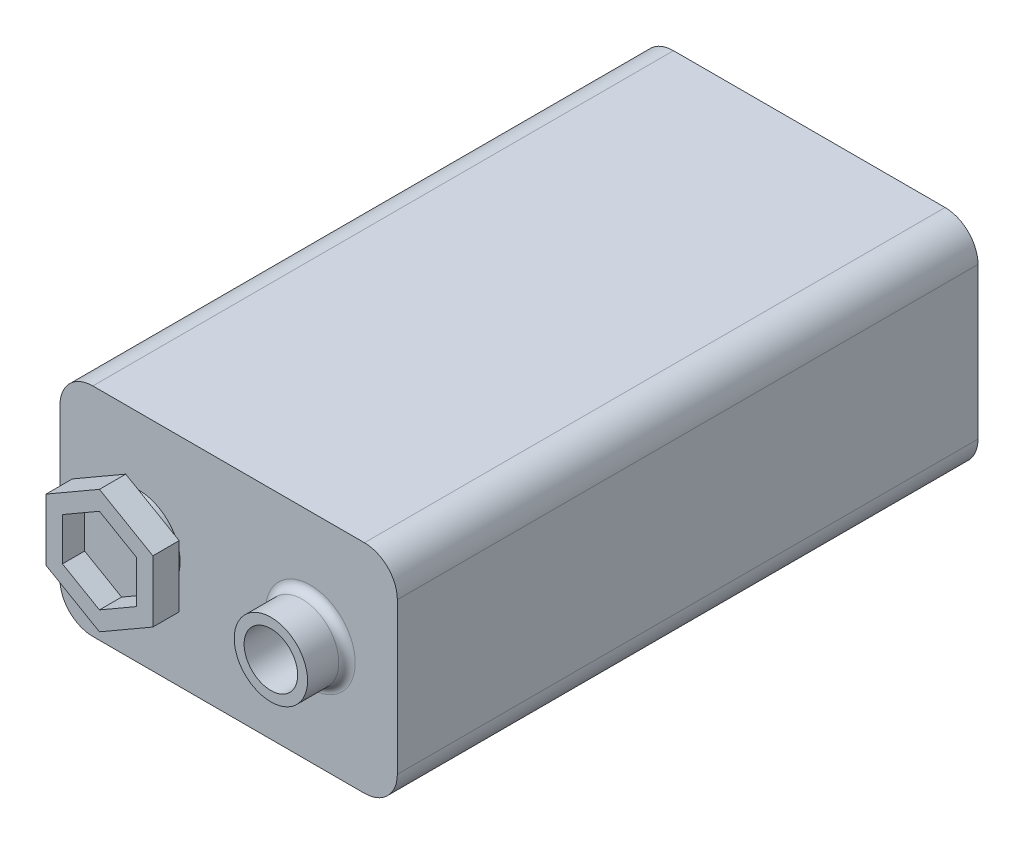
ISO-10303-21;
HEADER;
FILE_DESCRIPTION(('STEP AP214'),'2;1');
FILE_NAME('part.step','',(''),(''),'','','');
FILE_SCHEMA(('AUTOMOTIVE_DESIGN { 1 0 10303 214 1 1 1 1 }'));
ENDSEC;
DATA;
#1=APPLICATION_CONTEXT('core data for automotive mechanical design processes');
#2=APPLICATION_PROTOCOL_DEFINITION('international standard','automotive_design',2000,#1);
#3=PRODUCT_CONTEXT('',#1,'mechanical');
#4=PRODUCT('Part','Part','',(#3));
#5=PRODUCT_RELATED_PRODUCT_CATEGORY('part','',(#4));
#6=PRODUCT_DEFINITION_FORMATION('','',#4);
#7=PRODUCT_DEFINITION_CONTEXT('part definition',#1,'design');
#8=PRODUCT_DEFINITION('design','',#6,#7);
#9=PRODUCT_DEFINITION_SHAPE('','',#8);
#10=(LENGTH_UNIT() NAMED_UNIT(*) SI_UNIT(.MILLI.,.METRE.));
#11=(NAMED_UNIT(*) PLANE_ANGLE_UNIT() SI_UNIT($,.RADIAN.));
#12=(NAMED_UNIT(*) SI_UNIT($,.STERADIAN.) SOLID_ANGLE_UNIT());
#13=UNCERTAINTY_MEASURE_WITH_UNIT(LENGTH_MEASURE(1.E-05),#10,'distance_accuracy_value','');
#14=(GEOMETRIC_REPRESENTATION_CONTEXT(3) GLOBAL_UNCERTAINTY_ASSIGNED_CONTEXT((#13)) GLOBAL_UNIT_ASSIGNED_CONTEXT((#10,
#11,#12)) REPRESENTATION_CONTEXT('',''));
#15=CARTESIAN_POINT('',(0.,0.,0.));
#16=DIRECTION('',(0.,0.,1.));
#17=DIRECTION('',(1.,0.,0.));
#18=AXIS2_PLACEMENT_3D('',#15,#16,#17);
#19=CARTESIAN_POINT('',(6.3119,0.,25.654));
#20=DIRECTION('',(0.,0.,-1.));
#21=DIRECTION('',(-1.,0.,0.));
#22=AXIS2_PLACEMENT_3D('',#19,#20,#21);
#23=CYLINDRICAL_SURFACE('',#22,2.8321);
#24=CARTESIAN_POINT('',(6.3119,0.,23.0632));
#25=DIRECTION('',(0.,0.,-1.));
#26=DIRECTION('',(-1.,0.,0.));
#27=AXIS2_PLACEMENT_3D('',#24,#25,#26);
#28=CIRCLE('',#27,2.8321);
#29=CARTESIAN_POINT('',(3.4798,0.,23.0632));
#30=VERTEX_POINT('',#29);
#31=EDGE_CURVE('E283',#30,#30,#28,.F.);
#32=ORIENTED_EDGE('',*,*,#31,.T.);
#33=EDGE_LOOP('',(#32));
#34=FACE_BOUND('',#33,.T.);
#35=CARTESIAN_POINT('',(6.3119,0.,25.4762));
#36=DIRECTION('',(0.,0.,1.));
#37=DIRECTION('',(1.,0.,0.));
#38=AXIS2_PLACEMENT_3D('',#35,#36,#37);
#39=CIRCLE('',#38,2.8321);
#40=CARTESIAN_POINT('',(9.144,0.,25.4762));
#41=VERTEX_POINT('',#40);
#42=EDGE_CURVE('E365',#41,#41,#39,.T.);
#43=ORIENTED_EDGE('',*,*,#42,.F.);
#44=EDGE_LOOP('',(#43));
#45=FACE_BOUND('',#44,.T.);
#46=ADVANCED_FACE('F40',(#34,#45),#23,.T.);
#47=CARTESIAN_POINT('',(-2.8067,-2.38301323608018,42.2007207872868));
#48=DIRECTION('',(-1.,0.,0.));
#49=DIRECTION('',(0.,-1.,0.));
#50=AXIS2_PLACEMENT_3D('',#47,#48,#49);
#51=PLANE('',#50);
#52=DIRECTION('',(0.,1.,0.));
#53=VECTOR('',#52,1.);
#54=CARTESIAN_POINT('',(-2.8067,-2.38301323608018,25.4762));
#55=LINE('',#54,#53);
#56=CARTESIAN_POINT('',(-2.8067,-2.38301323608018,25.4762));
#57=VERTEX_POINT('',#56);
#58=CARTESIAN_POINT('',(-2.8067,2.38301323608018,25.4762));
#59=VERTEX_POINT('',#58);
#60=EDGE_CURVE('E175',#57,#59,#55,.T.);
#61=ORIENTED_EDGE('',*,*,#60,.F.);
#62=DIRECTION('',(0.,0.,-1.));
#63=VECTOR('',#62,1.);
#64=CARTESIAN_POINT('',(-2.8067,-2.38301323608018,42.2007207872868));
#65=LINE('',#64,#63);
#66=CARTESIAN_POINT('',(-2.8067,-2.38301323608018,23.4442));
#67=VERTEX_POINT('',#66);
#68=EDGE_CURVE('E184',#57,#67,#65,.T.);
#69=ORIENTED_EDGE('',*,*,#68,.T.);
#70=DIRECTION('',(0.,1.,0.));
#71=VECTOR('',#70,1.);
#72=CARTESIAN_POINT('',(-2.8067,-2.38301323608018,23.4442));
#73=LINE('',#72,#71);
#74=CARTESIAN_POINT('',(-2.8067,2.38301323608018,23.4442));
#75=VERTEX_POINT('',#74);
#76=EDGE_CURVE('E194',#67,#75,#73,.T.);
#77=ORIENTED_EDGE('',*,*,#76,.T.);
#78=DIRECTION('',(0.,0.,-1.));
#79=VECTOR('',#78,1.);
#80=CARTESIAN_POINT('',(-2.8067,2.38301323608018,42.2007207872868));
#81=LINE('',#80,#79);
#82=EDGE_CURVE('E186',#59,#75,#81,.T.);
#83=ORIENTED_EDGE('',*,*,#82,.F.);
#84=EDGE_LOOP('',(#61,#69,#77,#83));
#85=FACE_BOUND('',#84,.T.);
#86=ADVANCED_FACE('F182',(#85),#51,.F.);
#87=CARTESIAN_POINT('',(-2.8067,2.38301323608018,42.2007207872868));
#88=DIRECTION('',(-0.5,-0.866025403784439,0.));
#89=DIRECTION('',(0.866025403784439,-0.5,0.));
#90=AXIS2_PLACEMENT_3D('',#87,#88,#89);
#91=PLANE('',#90);
#92=DIRECTION('',(-0.866025403784439,0.5,0.));
#93=VECTOR('',#92,1.);
#94=CARTESIAN_POINT('',(-2.8067,2.38301323608018,25.4762));
#95=LINE('',#94,#93);
#96=CARTESIAN_POINT('',(-6.9342,4.76602647216036,25.4762));
#97=VERTEX_POINT('',#96);
#98=EDGE_CURVE('E188',#59,#97,#95,.T.);
#99=ORIENTED_EDGE('',*,*,#98,.F.);
#100=ORIENTED_EDGE('',*,*,#82,.T.);
#101=DIRECTION('',(-0.866025403784439,0.5,0.));
#102=VECTOR('',#101,1.);
#103=CARTESIAN_POINT('',(-2.8067,2.38301323608018,23.4442));
#104=LINE('',#103,#102);
#105=CARTESIAN_POINT('',(-6.9342,4.76602647216036,23.4442));
#106=VERTEX_POINT('',#105);
#107=EDGE_CURVE('E311',#75,#106,#104,.T.);
#108=ORIENTED_EDGE('',*,*,#107,.T.);
#109=DIRECTION('',(0.,0.,-1.));
#110=VECTOR('',#109,1.);
#111=CARTESIAN_POINT('',(-6.9342,4.76602647216036,42.2007207872868));
#112=LINE('',#111,#110);
#113=EDGE_CURVE('E317',#97,#106,#112,.T.);
#114=ORIENTED_EDGE('',*,*,#113,.F.);
#115=EDGE_LOOP('',(#99,#100,#108,#114));
#116=FACE_BOUND('',#115,.T.);
#117=ADVANCED_FACE('F388',(#116),#91,.F.);
#118=CARTESIAN_POINT('',(-6.9342,4.76602647216036,42.2007207872868));
#119=DIRECTION('',(0.5,-0.866025403784439,0.));
#120=DIRECTION('',(0.866025403784439,0.5,0.));
#121=AXIS2_PLACEMENT_3D('',#118,#119,#120);
#122=PLANE('',#121);
#123=DIRECTION('',(-0.866025403784439,-0.5,0.));
#124=VECTOR('',#123,1.);
#125=CARTESIAN_POINT('',(-6.9342,4.76602647216036,25.4762));
#126=LINE('',#125,#124);
#127=CARTESIAN_POINT('',(-11.0617,2.38301323608018,25.4762));
#128=VERTEX_POINT('',#127);
#129=EDGE_CURVE('E371',#97,#128,#126,.T.);
#130=ORIENTED_EDGE('',*,*,#129,.F.);
#131=ORIENTED_EDGE('',*,*,#113,.T.);
#132=DIRECTION('',(-0.866025403784439,-0.5,0.));
#133=VECTOR('',#132,1.);
#134=CARTESIAN_POINT('',(-6.9342,4.76602647216036,23.4442));
#135=LINE('',#134,#133);
#136=CARTESIAN_POINT('',(-11.0617,2.38301323608018,23.4442));
#137=VERTEX_POINT('',#136);
#138=EDGE_CURVE('E314',#106,#137,#135,.T.);
#139=ORIENTED_EDGE('',*,*,#138,.T.);
#140=DIRECTION('',(0.,0.,-1.));
#141=VECTOR('',#140,1.);
#142=CARTESIAN_POINT('',(-11.0617,2.38301323608018,42.2007207872868));
#143=LINE('',#142,#141);
#144=EDGE_CURVE('E324',#128,#137,#143,.T.);
#145=ORIENTED_EDGE('',*,*,#144,.F.);
#146=EDGE_LOOP('',(#130,#131,#139,#145));
#147=FACE_BOUND('',#146,.T.);
#148=ADVANCED_FACE('F381',(#147),#122,.F.);
#149=CARTESIAN_POINT('',(-11.0617,2.38301323608018,42.2007207872868));
#150=DIRECTION('',(1.,0.,0.));
#151=DIRECTION('',(0.,0.,-1.));
#152=AXIS2_PLACEMENT_3D('',#149,#150,#151);
#153=PLANE('',#152);
#154=DIRECTION('',(0.,-1.,0.));
#155=VECTOR('',#154,1.);
#156=CARTESIAN_POINT('',(-11.0617,2.38301323608018,25.4762));
#157=LINE('',#156,#155);
#158=CARTESIAN_POINT('',(-11.0617,-2.38301323608018,25.4762));
#159=VERTEX_POINT('',#158);
#160=EDGE_CURVE('E373',#128,#159,#157,.T.);
#161=ORIENTED_EDGE('',*,*,#160,.F.);
#162=ORIENTED_EDGE('',*,*,#144,.T.);
#163=DIRECTION('',(0.,-1.,0.));
#164=VECTOR('',#163,1.);
#165=CARTESIAN_POINT('',(-11.0617,2.38301323608018,23.4442));
#166=LINE('',#165,#164);
#167=CARTESIAN_POINT('',(-11.0617,-2.38301323608018,23.4442));
#168=VERTEX_POINT('',#167);
#169=EDGE_CURVE('E325',#137,#168,#166,.T.);
#170=ORIENTED_EDGE('',*,*,#169,.T.);
#171=DIRECTION('',(0.,0.,-1.));
#172=VECTOR('',#171,1.);
#173=CARTESIAN_POINT('',(-11.0617,-2.38301323608018,42.2007207872868));
#174=LINE('',#173,#172);
#175=EDGE_CURVE('E326',#159,#168,#174,.T.);
#176=ORIENTED_EDGE('',*,*,#175,.F.);
#177=EDGE_LOOP('',(#161,#162,#170,#176));
#178=FACE_BOUND('',#177,.T.);
#179=ADVANCED_FACE('F379',(#178),#153,.F.);
#180=CARTESIAN_POINT('',(-11.0617,-2.38301323608018,42.2007207872868));
#181=DIRECTION('',(0.5,0.866025403784439,0.));
#182=DIRECTION('',(-0.866025403784439,0.5,0.));
#183=AXIS2_PLACEMENT_3D('',#180,#181,#182);
#184=PLANE('',#183);
#185=DIRECTION('',(0.866025403784439,-0.5,0.));
#186=VECTOR('',#185,1.);
#187=CARTESIAN_POINT('',(-11.0617,-2.38301323608018,25.4762));
#188=LINE('',#187,#186);
#189=CARTESIAN_POINT('',(-6.9342,-4.76602647216036,25.4762));
#190=VERTEX_POINT('',#189);
#191=EDGE_CURVE('E62',#159,#190,#188,.T.);
#192=ORIENTED_EDGE('',*,*,#191,.F.);
#193=ORIENTED_EDGE('',*,*,#175,.T.);
#194=DIRECTION('',(0.866025403784439,-0.5,0.));
#195=VECTOR('',#194,1.);
#196=CARTESIAN_POINT('',(-11.0617,-2.38301323608018,23.4442));
#197=LINE('',#196,#195);
#198=CARTESIAN_POINT('',(-6.9342,-4.76602647216036,23.4442));
#199=VERTEX_POINT('',#198);
#200=EDGE_CURVE('E327',#168,#199,#197,.T.);
#201=ORIENTED_EDGE('',*,*,#200,.T.);
#202=DIRECTION('',(0.,0.,-1.));
#203=VECTOR('',#202,1.);
#204=CARTESIAN_POINT('',(-6.9342,-4.76602647216036,42.2007207872868));
#205=LINE('',#204,#203);
#206=EDGE_CURVE('E203',#190,#199,#205,.T.);
#207=ORIENTED_EDGE('',*,*,#206,.F.);
#208=EDGE_LOOP('',(#192,#193,#201,#207));
#209=FACE_BOUND('',#208,.T.);
#210=ADVANCED_FACE('F378',(#209),#184,.F.);
#211=CARTESIAN_POINT('',(-6.9342,-4.76602647216036,42.2007207872868));
#212=DIRECTION('',(-0.5,0.866025403784439,0.));
#213=DIRECTION('',(-0.866025403784439,-0.5,0.));
#214=AXIS2_PLACEMENT_3D('',#211,#212,#213);
#215=PLANE('',#214);
#216=DIRECTION('',(0.866025403784439,0.5,0.));
#217=VECTOR('',#216,1.);
#218=CARTESIAN_POINT('',(-6.9342,-4.76602647216036,25.4762));
#219=LINE('',#218,#217);
#220=EDGE_CURVE('E12',#190,#57,#219,.T.);
#221=ORIENTED_EDGE('',*,*,#220,.F.);
#222=ORIENTED_EDGE('',*,*,#206,.T.);
#223=DIRECTION('',(0.866025403784439,0.5,0.));
#224=VECTOR('',#223,1.);
#225=CARTESIAN_POINT('',(-6.9342,-4.76602647216036,23.4442));
#226=LINE('',#225,#224);
#227=EDGE_CURVE('E192',#199,#67,#226,.T.);
#228=ORIENTED_EDGE('',*,*,#227,.T.);
#229=ORIENTED_EDGE('',*,*,#68,.F.);
#230=EDGE_LOOP('',(#221,#222,#228,#229));
#231=FACE_BOUND('',#230,.T.);
#232=ADVANCED_FACE('F190',(#231),#215,.F.);
#233=CARTESIAN_POINT('',(13.0302,8.382,22.4282));
#234=DIRECTION('',(-1.,0.,0.));
#235=DIRECTION('',(0.,0.,1.));
#236=AXIS2_PLACEMENT_3D('',#233,#234,#235);
#237=PLANE('',#236);
#238=DIRECTION('',(0.,-1.,0.));
#239=VECTOR('',#238,1.);
#240=CARTESIAN_POINT('',(13.0302,8.382,-22.4282));
#241=LINE('',#240,#239);
#242=CARTESIAN_POINT('',(13.0302,5.842,-22.4282));
#243=VERTEX_POINT('',#242);
#244=CARTESIAN_POINT('',(13.0302,-5.842,-22.4282));
#245=VERTEX_POINT('',#244);
#246=EDGE_CURVE('E241',#243,#245,#241,.T.);
#247=ORIENTED_EDGE('',*,*,#246,.F.);
#248=DIRECTION('',(0.,0.,-1.));
#249=VECTOR('',#248,1.);
#250=CARTESIAN_POINT('',(13.0302,5.842,22.4282));
#251=LINE('',#250,#249);
#252=CARTESIAN_POINT('',(13.0302,5.842,22.4282));
#253=VERTEX_POINT('',#252);
#254=EDGE_CURVE('E264',#243,#253,#251,.F.);
#255=ORIENTED_EDGE('',*,*,#254,.T.);
#256=DIRECTION('',(0.,-1.,0.));
#257=VECTOR('',#256,1.);
#258=CARTESIAN_POINT('',(13.0302,8.382,22.4282));
#259=LINE('',#258,#257);
#260=CARTESIAN_POINT('',(13.0302,-5.842,22.4282));
#261=VERTEX_POINT('',#260);
#262=EDGE_CURVE('E228',#253,#261,#259,.T.);
#263=ORIENTED_EDGE('',*,*,#262,.T.);
#264=DIRECTION('',(0.,0.,-1.));
#265=VECTOR('',#264,1.);
#266=CARTESIAN_POINT('',(13.0302,-5.842,-22.4282));
#267=LINE('',#266,#265);
#268=EDGE_CURVE('E261',#261,#245,#267,.T.);
#269=ORIENTED_EDGE('',*,*,#268,.T.);
#270=EDGE_LOOP('',(#247,#255,#263,#269));
#271=FACE_BOUND('',#270,.T.);
#272=ADVANCED_FACE('F423',(#271),#237,.F.);
#273=CARTESIAN_POINT('',(-13.0302,8.382,-22.4282));
#274=DIRECTION('',(0.,0.,1.));
#275=DIRECTION('',(1.,0.,0.));
#276=AXIS2_PLACEMENT_3D('',#273,#274,#275);
#277=PLANE('',#276);
#278=DIRECTION('',(-1.,0.,0.));
#279=VECTOR('',#278,1.);
#280=CARTESIAN_POINT('',(-13.0302,8.382,-22.4282));
#281=LINE('',#280,#279);
#282=CARTESIAN_POINT('',(10.4902,8.382,-22.4282));
#283=VERTEX_POINT('',#282);
#284=CARTESIAN_POINT('',(-10.4902,8.382,-22.4282));
#285=VERTEX_POINT('',#284);
#286=EDGE_CURVE('E221',#283,#285,#281,.T.);
#287=ORIENTED_EDGE('',*,*,#286,.F.);
#288=CARTESIAN_POINT('',(10.4902,5.842,-22.4282));
#289=DIRECTION('',(0.,0.,1.));
#290=DIRECTION('',(1.,0.,0.));
#291=AXIS2_PLACEMENT_3D('',#288,#289,#290);
#292=CIRCLE('',#291,2.54);
#293=EDGE_CURVE('E259',#283,#243,#292,.F.);
#294=ORIENTED_EDGE('',*,*,#293,.T.);
#295=ORIENTED_EDGE('',*,*,#246,.T.);
#296=CARTESIAN_POINT('',(10.4902,-5.842,-22.4282));
#297=DIRECTION('',(0.,0.,1.));
#298=DIRECTION('',(1.,0.,0.));
#299=AXIS2_PLACEMENT_3D('',#296,#297,#298);
#300=CIRCLE('',#299,2.54);
#301=CARTESIAN_POINT('',(10.4902,-8.382,-22.4282));
#302=VERTEX_POINT('',#301);
#303=EDGE_CURVE('E257',#245,#302,#300,.F.);
#304=ORIENTED_EDGE('',*,*,#303,.T.);
#305=DIRECTION('',(-1.,0.,0.));
#306=VECTOR('',#305,1.);
#307=CARTESIAN_POINT('',(-13.0302,-8.382,-22.4282));
#308=LINE('',#307,#306);
#309=CARTESIAN_POINT('',(-10.4902,-8.382,-22.4282));
#310=VERTEX_POINT('',#309);
#311=EDGE_CURVE('E220',#302,#310,#308,.T.);
#312=ORIENTED_EDGE('',*,*,#311,.T.);
#313=CARTESIAN_POINT('',(-10.4902,-5.842,-22.4282));
#314=DIRECTION('',(0.,0.,1.));
#315=DIRECTION('',(1.,0.,0.));
#316=AXIS2_PLACEMENT_3D('',#313,#314,#315);
#317=CIRCLE('',#316,2.54);
#318=CARTESIAN_POINT('',(-13.0302,-5.842,-22.4282));
#319=VERTEX_POINT('',#318);
#320=EDGE_CURVE('E255',#310,#319,#317,.F.);
#321=ORIENTED_EDGE('',*,*,#320,.T.);
#322=DIRECTION('',(0.,-1.,0.));
#323=VECTOR('',#322,1.);
#324=CARTESIAN_POINT('',(-13.0302,8.382,-22.4282));
#325=LINE('',#324,#323);
#326=CARTESIAN_POINT('',(-13.0302,5.842,-22.4282));
#327=VERTEX_POINT('',#326);
#328=EDGE_CURVE('E238',#327,#319,#325,.T.);
#329=ORIENTED_EDGE('',*,*,#328,.F.);
#330=CARTESIAN_POINT('',(-10.4902,5.842,-22.4282));
#331=DIRECTION('',(0.,0.,1.));
#332=DIRECTION('',(1.,0.,0.));
#333=AXIS2_PLACEMENT_3D('',#330,#331,#332);
#334=CIRCLE('',#333,2.54);
#335=EDGE_CURVE('E253',#327,#285,#334,.F.);
#336=ORIENTED_EDGE('',*,*,#335,.T.);
#337=EDGE_LOOP('',(#287,#294,#295,#304,#312,#321,#329,#336));
#338=FACE_BOUND('',#337,.T.);
#339=ADVANCED_FACE('F419',(#338),#277,.F.);
#340=CARTESIAN_POINT('',(-13.0302,8.382,22.4282));
#341=DIRECTION('',(1.,0.,0.));
#342=DIRECTION('',(0.,0.,-1.));
#343=AXIS2_PLACEMENT_3D('',#340,#341,#342);
#344=PLANE('',#343);
#345=ORIENTED_EDGE('',*,*,#328,.T.);
#346=DIRECTION('',(0.,0.,1.));
#347=VECTOR('',#346,1.);
#348=CARTESIAN_POINT('',(-13.0302,-5.842,22.4282));
#349=LINE('',#348,#347);
#350=CARTESIAN_POINT('',(-13.0302,-5.842,22.4282));
#351=VERTEX_POINT('',#350);
#352=EDGE_CURVE('E280',#319,#351,#349,.T.);
#353=ORIENTED_EDGE('',*,*,#352,.T.);
#354=DIRECTION('',(0.,-1.,0.));
#355=VECTOR('',#354,1.);
#356=CARTESIAN_POINT('',(-13.0302,8.382,22.4282));
#357=LINE('',#356,#355);
#358=CARTESIAN_POINT('',(-13.0302,5.842,22.4282));
#359=VERTEX_POINT('',#358);
#360=EDGE_CURVE('E235',#359,#351,#357,.T.);
#361=ORIENTED_EDGE('',*,*,#360,.F.);
#362=DIRECTION('',(0.,0.,1.));
#363=VECTOR('',#362,1.);
#364=CARTESIAN_POINT('',(-13.0302,5.842,22.4282));
#365=LINE('',#364,#363);
#366=EDGE_CURVE('E278',#359,#327,#365,.F.);
#367=ORIENTED_EDGE('',*,*,#366,.T.);
#368=EDGE_LOOP('',(#345,#353,#361,#367));
#369=FACE_BOUND('',#368,.T.);
#370=ADVANCED_FACE('F414',(#369),#344,.F.);
#371=CARTESIAN_POINT('',(-13.0302,8.382,22.4282));
#372=DIRECTION('',(0.,0.,-1.));
#373=DIRECTION('',(-1.,0.,0.));
#374=AXIS2_PLACEMENT_3D('',#371,#372,#373);
#375=PLANE('',#374);
#376=CARTESIAN_POINT('',(6.3119,0.,22.4282));
#377=DIRECTION('',(0.,0.,-1.));
#378=DIRECTION('',(-1.,0.,0.));
#379=AXIS2_PLACEMENT_3D('',#376,#377,#378);
#380=CIRCLE('',#379,3.4671);
#381=CARTESIAN_POINT('',(2.8448,0.,22.4282));
#382=VERTEX_POINT('',#381);
#383=EDGE_CURVE('E286',#382,#382,#380,.T.);
#384=ORIENTED_EDGE('',*,*,#383,.T.);
#385=EDGE_LOOP('',(#384));
#386=FACE_BOUND('',#385,.T.);
#387=CARTESIAN_POINT('',(-6.9342,0.,22.4282));
#388=DIRECTION('',(0.,0.,-1.));
#389=DIRECTION('',(-1.,0.,0.));
#390=AXIS2_PLACEMENT_3D('',#387,#388,#389);
#391=CIRCLE('',#390,3.1877);
#392=CARTESIAN_POINT('',(-10.1219,0.,22.4282));
#393=VERTEX_POINT('',#392);
#394=EDGE_CURVE('E244',#393,#393,#391,.F.);
#395=ORIENTED_EDGE('',*,*,#394,.F.);
#396=EDGE_LOOP('',(#395));
#397=FACE_BOUND('',#396,.T.);
#398=ORIENTED_EDGE('',*,*,#262,.F.);
#399=CARTESIAN_POINT('',(10.4902,5.842,22.4282));
#400=DIRECTION('',(0.,0.,-1.));
#401=DIRECTION('',(-1.,0.,0.));
#402=AXIS2_PLACEMENT_3D('',#399,#400,#401);
#403=CIRCLE('',#402,2.54);
#404=CARTESIAN_POINT('',(10.4902,8.382,22.4282));
#405=VERTEX_POINT('',#404);
#406=EDGE_CURVE('E272',#253,#405,#403,.F.);
#407=ORIENTED_EDGE('',*,*,#406,.T.);
#408=DIRECTION('',(1.,0.,0.));
#409=VECTOR('',#408,1.);
#410=CARTESIAN_POINT('',(-13.0302,8.382,22.4282));
#411=LINE('',#410,#409);
#412=CARTESIAN_POINT('',(-10.4902,8.382,22.4282));
#413=VERTEX_POINT('',#412);
#414=EDGE_CURVE('E224',#413,#405,#411,.T.);
#415=ORIENTED_EDGE('',*,*,#414,.F.);
#416=CARTESIAN_POINT('',(-10.4902,5.842,22.4282));
#417=DIRECTION('',(0.,0.,-1.));
#418=DIRECTION('',(-1.,0.,0.));
#419=AXIS2_PLACEMENT_3D('',#416,#417,#418);
#420=CIRCLE('',#419,2.54);
#421=EDGE_CURVE('E266',#413,#359,#420,.F.);
#422=ORIENTED_EDGE('',*,*,#421,.T.);
#423=ORIENTED_EDGE('',*,*,#360,.T.);
#424=CARTESIAN_POINT('',(-10.4902,-5.842,22.4282));
#425=DIRECTION('',(0.,0.,-1.));
#426=DIRECTION('',(-1.,0.,0.));
#427=AXIS2_PLACEMENT_3D('',#424,#425,#426);
#428=CIRCLE('',#427,2.54);
#429=CARTESIAN_POINT('',(-10.4902,-8.382,22.4282));
#430=VERTEX_POINT('',#429);
#431=EDGE_CURVE('E268',#351,#430,#428,.F.);
#432=ORIENTED_EDGE('',*,*,#431,.T.);
#433=DIRECTION('',(1.,0.,0.));
#434=VECTOR('',#433,1.);
#435=CARTESIAN_POINT('',(-13.0302,-8.382,22.4282));
#436=LINE('',#435,#434);
#437=CARTESIAN_POINT('',(10.4902,-8.382,22.4282));
#438=VERTEX_POINT('',#437);
#439=EDGE_CURVE('E225',#430,#438,#436,.T.);
#440=ORIENTED_EDGE('',*,*,#439,.T.);
#441=CARTESIAN_POINT('',(10.4902,-5.842,22.4282));
#442=DIRECTION('',(0.,0.,-1.));
#443=DIRECTION('',(-1.,0.,0.));
#444=AXIS2_PLACEMENT_3D('',#441,#442,#443);
#445=CIRCLE('',#444,2.54);
#446=EDGE_CURVE('E270',#438,#261,#445,.F.);
#447=ORIENTED_EDGE('',*,*,#446,.T.);
#448=EDGE_LOOP('',(#398,#407,#415,#422,#423,#432,#440,#447));
#449=FACE_BOUND('',#448,.T.);
#450=ADVANCED_FACE('F407',(#386,#397,#449),#375,.F.);
#451=CARTESIAN_POINT('',(0.,8.382,0.));
#452=DIRECTION('',(0.,-1.,0.));
#453=DIRECTION('',(0.,0.,-1.));
#454=AXIS2_PLACEMENT_3D('',#451,#452,#453);
#455=PLANE('',#454);
#456=ORIENTED_EDGE('',*,*,#414,.T.);
#457=DIRECTION('',(0.,0.,-1.));
#458=VECTOR('',#457,1.);
#459=CARTESIAN_POINT('',(10.4902,8.382,0.));
#460=LINE('',#459,#458);
#461=EDGE_CURVE('E250',#405,#283,#460,.T.);
#462=ORIENTED_EDGE('',*,*,#461,.T.);
#463=ORIENTED_EDGE('',*,*,#286,.T.);
#464=DIRECTION('',(0.,0.,1.));
#465=VECTOR('',#464,1.);
#466=CARTESIAN_POINT('',(-10.4902,8.382,0.));
#467=LINE('',#466,#465);
#468=EDGE_CURVE('E247',#285,#413,#467,.T.);
#469=ORIENTED_EDGE('',*,*,#468,.T.);
#470=EDGE_LOOP('',(#456,#462,#463,#469));
#471=FACE_BOUND('',#470,.T.);
#472=ADVANCED_FACE('F403',(#471),#455,.F.);
#473=CARTESIAN_POINT('',(0.,-8.382,0.));
#474=DIRECTION('',(0.,-1.,0.));
#475=DIRECTION('',(0.,0.,-1.));
#476=AXIS2_PLACEMENT_3D('',#473,#474,#475);
#477=PLANE('',#476);
#478=ORIENTED_EDGE('',*,*,#311,.F.);
#479=DIRECTION('',(0.,0.,-1.));
#480=VECTOR('',#479,1.);
#481=CARTESIAN_POINT('',(10.4902,-8.382,22.4282));
#482=LINE('',#481,#480);
#483=EDGE_CURVE('E276',#302,#438,#482,.F.);
#484=ORIENTED_EDGE('',*,*,#483,.T.);
#485=ORIENTED_EDGE('',*,*,#439,.F.);
#486=DIRECTION('',(0.,0.,1.));
#487=VECTOR('',#486,1.);
#488=CARTESIAN_POINT('',(-10.4902,-8.382,-22.4282));
#489=LINE('',#488,#487);
#490=EDGE_CURVE('E274',#430,#310,#489,.F.);
#491=ORIENTED_EDGE('',*,*,#490,.T.);
#492=EDGE_LOOP('',(#478,#484,#485,#491));
#493=FACE_BOUND('',#492,.T.);
#494=ADVANCED_FACE('F406',(#493),#477,.T.);
#495=CARTESIAN_POINT('',(-6.9342,0.,23.4442));
#496=DIRECTION('',(0.,0.,-1.));
#497=DIRECTION('',(-1.,0.,0.));
#498=AXIS2_PLACEMENT_3D('',#495,#496,#497);
#499=CYLINDRICAL_SURFACE('',#498,3.1877);
#500=CARTESIAN_POINT('',(-6.9342,0.,22.8092));
#501=DIRECTION('',(0.,0.,1.));
#502=DIRECTION('',(1.,0.,0.));
#503=AXIS2_PLACEMENT_3D('',#500,#501,#502);
#504=CIRCLE('',#503,3.1877);
#505=CARTESIAN_POINT('',(-3.7465,0.,22.8092));
#506=VERTEX_POINT('',#505);
#507=EDGE_CURVE('E48',#506,#506,#504,.F.);
#508=ORIENTED_EDGE('',*,*,#507,.T.);
#509=EDGE_LOOP('',(#508));
#510=FACE_BOUND('',#509,.T.);
#511=ORIENTED_EDGE('',*,*,#394,.T.);
#512=EDGE_LOOP('',(#511));
#513=FACE_BOUND('',#512,.T.);
#514=ADVANCED_FACE('F294',(#510,#513),#499,.T.);
#515=CARTESIAN_POINT('',(0.,0.,23.4442));
#516=DIRECTION('',(0.,0.,1.));
#517=DIRECTION('',(1.,0.,0.));
#518=AXIS2_PLACEMENT_3D('',#515,#516,#517);
#519=PLANE('',#518);
#520=CARTESIAN_POINT('',(-6.9342,0.,23.4442));
#521=DIRECTION('',(0.,0.,1.));
#522=DIRECTION('',(1.,0.,0.));
#523=AXIS2_PLACEMENT_3D('',#520,#521,#522);
#524=CIRCLE('',#523,3.8227);
#525=CARTESIAN_POINT('',(-3.1115,0.,23.4442));
#526=VERTEX_POINT('',#525);
#527=EDGE_CURVE('E289',#526,#526,#524,.T.);
#528=ORIENTED_EDGE('',*,*,#527,.T.);
#529=EDGE_LOOP('',(#528));
#530=FACE_BOUND('',#529,.T.);
#531=ORIENTED_EDGE('',*,*,#76,.F.);
#532=ORIENTED_EDGE('',*,*,#227,.F.);
#533=ORIENTED_EDGE('',*,*,#200,.F.);
#534=ORIENTED_EDGE('',*,*,#169,.F.);
#535=ORIENTED_EDGE('',*,*,#138,.F.);
#536=ORIENTED_EDGE('',*,*,#107,.F.);
#537=EDGE_LOOP('',(#531,#532,#533,#534,#535,#536));
#538=FACE_BOUND('',#537,.T.);
#539=ADVANCED_FACE('F302',(#530,#538),#519,.F.);
#540=CARTESIAN_POINT('',(10.4902,5.842,0.));
#541=DIRECTION('',(0.,0.,-1.));
#542=DIRECTION('',(-1.,0.,0.));
#543=AXIS2_PLACEMENT_3D('',#540,#541,#542);
#544=CYLINDRICAL_SURFACE('',#543,2.54);
#545=ORIENTED_EDGE('',*,*,#406,.F.);
#546=ORIENTED_EDGE('',*,*,#254,.F.);
#547=ORIENTED_EDGE('',*,*,#293,.F.);
#548=ORIENTED_EDGE('',*,*,#461,.F.);
#549=EDGE_LOOP('',(#545,#546,#547,#548));
#550=FACE_BOUND('',#549,.T.);
#551=ADVANCED_FACE('F305',(#550),#544,.T.);
#552=CARTESIAN_POINT('',(10.4902,-5.842,22.4282));
#553=DIRECTION('',(0.,0.,1.));
#554=DIRECTION('',(1.,0.,0.));
#555=AXIS2_PLACEMENT_3D('',#552,#553,#554);
#556=CYLINDRICAL_SURFACE('',#555,2.54);
#557=ORIENTED_EDGE('',*,*,#446,.F.);
#558=ORIENTED_EDGE('',*,*,#483,.F.);
#559=ORIENTED_EDGE('',*,*,#303,.F.);
#560=ORIENTED_EDGE('',*,*,#268,.F.);
#561=EDGE_LOOP('',(#557,#558,#559,#560));
#562=FACE_BOUND('',#561,.T.);
#563=ADVANCED_FACE('F430',(#562),#556,.T.);
#564=CARTESIAN_POINT('',(-10.4902,-5.842,22.4282));
#565=DIRECTION('',(0.,0.,-1.));
#566=DIRECTION('',(-1.,0.,0.));
#567=AXIS2_PLACEMENT_3D('',#564,#565,#566);
#568=CYLINDRICAL_SURFACE('',#567,2.54);
#569=ORIENTED_EDGE('',*,*,#320,.F.);
#570=ORIENTED_EDGE('',*,*,#490,.F.);
#571=ORIENTED_EDGE('',*,*,#431,.F.);
#572=ORIENTED_EDGE('',*,*,#352,.F.);
#573=EDGE_LOOP('',(#569,#570,#571,#572));
#574=FACE_BOUND('',#573,.T.);
#575=ADVANCED_FACE('F434',(#574),#568,.T.);
#576=CARTESIAN_POINT('',(-10.4902,5.842,0.));
#577=DIRECTION('',(0.,0.,1.));
#578=DIRECTION('',(1.,0.,0.));
#579=AXIS2_PLACEMENT_3D('',#576,#577,#578);
#580=CYLINDRICAL_SURFACE('',#579,2.54);
#581=ORIENTED_EDGE('',*,*,#335,.F.);
#582=ORIENTED_EDGE('',*,*,#366,.F.);
#583=ORIENTED_EDGE('',*,*,#421,.F.);
#584=ORIENTED_EDGE('',*,*,#468,.F.);
#585=EDGE_LOOP('',(#581,#582,#583,#584));
#586=FACE_BOUND('',#585,.T.);
#587=ADVANCED_FACE('F438',(#586),#580,.T.);
#588=CARTESIAN_POINT('',(6.3119,0.,23.0632));
#589=DIRECTION('',(0.,0.,-1.));
#590=DIRECTION('',(-1.,0.,0.));
#591=AXIS2_PLACEMENT_3D('',#588,#589,#590);
#592=TOROIDAL_SURFACE('',#591,3.4671,0.635);
#593=ORIENTED_EDGE('',*,*,#383,.F.);
#594=EDGE_LOOP('',(#593));
#595=FACE_BOUND('',#594,.T.);
#596=ORIENTED_EDGE('',*,*,#31,.F.);
#597=EDGE_LOOP('',(#596));
#598=FACE_BOUND('',#597,.T.);
#599=ADVANCED_FACE('F299',(#595,#598),#592,.F.);
#600=CARTESIAN_POINT('',(-6.9342,0.,22.8092));
#601=DIRECTION('',(0.,0.,1.));
#602=DIRECTION('',(1.,0.,0.));
#603=AXIS2_PLACEMENT_3D('',#600,#601,#602);
#604=TOROIDAL_SURFACE('',#603,3.8227,0.635);
#605=ORIENTED_EDGE('',*,*,#507,.F.);
#606=EDGE_LOOP('',(#605));
#607=FACE_BOUND('',#606,.T.);
#608=ORIENTED_EDGE('',*,*,#527,.F.);
#609=EDGE_LOOP('',(#608));
#610=FACE_BOUND('',#609,.T.);
#611=ADVANCED_FACE('F42',(#607,#610),#604,.F.);
#612=CARTESIAN_POINT('',(-13.0302,8.382,25.4762));
#613=DIRECTION('',(0.,0.,1.));
#614=DIRECTION('',(1.,0.,0.));
#615=AXIS2_PLACEMENT_3D('',#612,#613,#614);
#616=PLANE('',#615);
#617=DIRECTION('',(-0.866025403784439,0.5,0.));
#618=VECTOR('',#617,1.);
#619=CARTESIAN_POINT('',(-4.0767,1.64977839420936,25.4762));
#620=LINE('',#619,#618);
#621=CARTESIAN_POINT('',(-4.0767,1.64977839420936,25.4762));
#622=VERTEX_POINT('',#621);
#623=CARTESIAN_POINT('',(-6.9342,3.29955678841871,25.4762));
#624=VERTEX_POINT('',#623);
#625=EDGE_CURVE('E363',#622,#624,#620,.T.);
#626=ORIENTED_EDGE('',*,*,#625,.F.);
#627=DIRECTION('',(0.,1.,0.));
#628=VECTOR('',#627,1.);
#629=CARTESIAN_POINT('',(-4.0767,-1.64977839420935,25.4762));
#630=LINE('',#629,#628);
#631=CARTESIAN_POINT('',(-4.0767,-1.64977839420935,25.4762));
#632=VERTEX_POINT('',#631);
#633=EDGE_CURVE('E360',#632,#622,#630,.T.);
#634=ORIENTED_EDGE('',*,*,#633,.F.);
#635=DIRECTION('',(0.866025403784439,0.5,0.));
#636=VECTOR('',#635,1.);
#637=CARTESIAN_POINT('',(-6.9342,-3.29955678841871,25.4762));
#638=LINE('',#637,#636);
#639=CARTESIAN_POINT('',(-6.9342,-3.29955678841871,25.4762));
#640=VERTEX_POINT('',#639);
#641=EDGE_CURVE('E357',#640,#632,#638,.T.);
#642=ORIENTED_EDGE('',*,*,#641,.F.);
#643=DIRECTION('',(0.866025403784439,-0.5,0.));
#644=VECTOR('',#643,1.);
#645=CARTESIAN_POINT('',(-9.7917,-1.64977839420935,25.4762));
#646=LINE('',#645,#644);
#647=CARTESIAN_POINT('',(-9.7917,-1.64977839420935,25.4762));
#648=VERTEX_POINT('',#647);
#649=EDGE_CURVE('E354',#648,#640,#646,.T.);
#650=ORIENTED_EDGE('',*,*,#649,.F.);
#651=DIRECTION('',(0.,-1.,0.));
#652=VECTOR('',#651,1.);
#653=CARTESIAN_POINT('',(-9.7917,1.64977839420936,25.4762));
#654=LINE('',#653,#652);
#655=CARTESIAN_POINT('',(-9.7917,1.64977839420936,25.4762));
#656=VERTEX_POINT('',#655);
#657=EDGE_CURVE('E351',#656,#648,#654,.T.);
#658=ORIENTED_EDGE('',*,*,#657,.F.);
#659=DIRECTION('',(-0.866025403784439,-0.5,0.));
#660=VECTOR('',#659,1.);
#661=CARTESIAN_POINT('',(-6.9342,3.29955678841871,25.4762));
#662=LINE('',#661,#660);
#663=EDGE_CURVE('E55',#624,#656,#662,.T.);
#664=ORIENTED_EDGE('',*,*,#663,.F.);
#665=EDGE_LOOP('',(#626,#634,#642,#650,#658,#664));
#666=FACE_BOUND('',#665,.T.);
#667=ORIENTED_EDGE('',*,*,#60,.T.);
#668=ORIENTED_EDGE('',*,*,#98,.T.);
#669=ORIENTED_EDGE('',*,*,#129,.T.);
#670=ORIENTED_EDGE('',*,*,#160,.T.);
#671=ORIENTED_EDGE('',*,*,#191,.T.);
#672=ORIENTED_EDGE('',*,*,#220,.T.);
#673=EDGE_LOOP('',(#667,#668,#669,#670,#671,#672));
#674=FACE_BOUND('',#673,.T.);
#675=ADVANCED_FACE('F174',(#666,#674),#616,.T.);
#676=CARTESIAN_POINT('',(6.3119,0.,25.4762));
#677=DIRECTION('',(0.,0.,1.));
#678=DIRECTION('',(1.,0.,0.));
#679=AXIS2_PLACEMENT_3D('',#676,#677,#678);
#680=CIRCLE('',#679,2.0701);
#681=CARTESIAN_POINT('',(8.382,0.,25.4762));
#682=VERTEX_POINT('',#681);
#683=EDGE_CURVE('E187',#682,#682,#680,.T.);
#684=ORIENTED_EDGE('',*,*,#683,.F.);
#685=EDGE_LOOP('',(#684));
#686=FACE_BOUND('',#685,.T.);
#687=ORIENTED_EDGE('',*,*,#42,.T.);
#688=EDGE_LOOP('',(#687));
#689=FACE_BOUND('',#688,.T.);
#690=ADVANCED_FACE('F538',(#686,#689),#616,.T.);
#691=CARTESIAN_POINT('',(0.,0.,23.7617));
#692=DIRECTION('',(0.,0.,-1.));
#693=DIRECTION('',(-1.,0.,0.));
#694=AXIS2_PLACEMENT_3D('',#691,#692,#693);
#695=PLANE('',#694);
#696=DIRECTION('',(0.866025403784439,-0.5,0.));
#697=VECTOR('',#696,1.);
#698=CARTESIAN_POINT('',(-6.9342,-3.29955678841871,23.7617));
#699=LINE('',#698,#697);
#700=CARTESIAN_POINT('',(-9.7917,-1.64977839420935,23.7617));
#701=VERTEX_POINT('',#700);
#702=CARTESIAN_POINT('',(-6.9342,-3.29955678841871,23.7617));
#703=VERTEX_POINT('',#702);
#704=EDGE_CURVE('E347',#701,#703,#699,.T.);
#705=ORIENTED_EDGE('',*,*,#704,.T.);
#706=DIRECTION('',(0.866025403784439,0.5,0.));
#707=VECTOR('',#706,1.);
#708=CARTESIAN_POINT('',(-4.0767,-1.64977839420935,23.7617));
#709=LINE('',#708,#707);
#710=CARTESIAN_POINT('',(-4.0767,-1.64977839420935,23.7617));
#711=VERTEX_POINT('',#710);
#712=EDGE_CURVE('E344',#703,#711,#709,.T.);
#713=ORIENTED_EDGE('',*,*,#712,.T.);
#714=DIRECTION('',(0.,1.,0.));
#715=VECTOR('',#714,1.);
#716=CARTESIAN_POINT('',(-4.0767,1.64977839420936,23.7617));
#717=LINE('',#716,#715);
#718=CARTESIAN_POINT('',(-4.0767,1.64977839420936,23.7617));
#719=VERTEX_POINT('',#718);
#720=EDGE_CURVE('E341',#711,#719,#717,.T.);
#721=ORIENTED_EDGE('',*,*,#720,.T.);
#722=DIRECTION('',(-0.866025403784439,0.5,0.));
#723=VECTOR('',#722,1.);
#724=CARTESIAN_POINT('',(-6.9342,3.29955678841871,23.7617));
#725=LINE('',#724,#723);
#726=CARTESIAN_POINT('',(-6.9342,3.29955678841871,23.7617));
#727=VERTEX_POINT('',#726);
#728=EDGE_CURVE('E338',#719,#727,#725,.T.);
#729=ORIENTED_EDGE('',*,*,#728,.T.);
#730=DIRECTION('',(-0.866025403784439,-0.5,0.));
#731=VECTOR('',#730,1.);
#732=CARTESIAN_POINT('',(-9.7917,1.64977839420936,23.7617));
#733=LINE('',#732,#731);
#734=CARTESIAN_POINT('',(-9.7917,1.64977839420936,23.7617));
#735=VERTEX_POINT('',#734);
#736=EDGE_CURVE('E199',#727,#735,#733,.T.);
#737=ORIENTED_EDGE('',*,*,#736,.T.);
#738=DIRECTION('',(0.,-1.,0.));
#739=VECTOR('',#738,1.);
#740=CARTESIAN_POINT('',(-9.7917,-1.64977839420935,23.7617));
#741=LINE('',#740,#739);
#742=EDGE_CURVE('E195',#735,#701,#741,.T.);
#743=ORIENTED_EDGE('',*,*,#742,.T.);
#744=EDGE_LOOP('',(#705,#713,#721,#729,#737,#743));
#745=FACE_BOUND('',#744,.T.);
#746=ADVANCED_FACE('F498',(#745),#695,.F.);
#747=CARTESIAN_POINT('',(-4.0767,1.64977839420936,42.2007207872868));
#748=DIRECTION('',(-0.5,-0.866025403784439,0.));
#749=DIRECTION('',(0.866025403784439,-0.5,0.));
#750=AXIS2_PLACEMENT_3D('',#747,#748,#749);
#751=PLANE('',#750);
#752=DIRECTION('',(0.,0.,-1.));
#753=VECTOR('',#752,1.);
#754=CARTESIAN_POINT('',(-4.0767,1.64977839420936,42.2007207872868));
#755=LINE('',#754,#753);
#756=EDGE_CURVE('E213',#622,#719,#755,.T.);
#757=ORIENTED_EDGE('',*,*,#756,.F.);
#758=ORIENTED_EDGE('',*,*,#625,.T.);
#759=DIRECTION('',(0.,0.,-1.));
#760=VECTOR('',#759,1.);
#761=CARTESIAN_POINT('',(-6.9342,3.29955678841871,42.2007207872868));
#762=LINE('',#761,#760);
#763=EDGE_CURVE('E215',#624,#727,#762,.T.);
#764=ORIENTED_EDGE('',*,*,#763,.T.);
#765=ORIENTED_EDGE('',*,*,#728,.F.);
#766=EDGE_LOOP('',(#757,#758,#764,#765));
#767=FACE_BOUND('',#766,.T.);
#768=ADVANCED_FACE('F495',(#767),#751,.T.);
#769=CARTESIAN_POINT('',(-4.0767,-1.64977839420935,42.2007207872868));
#770=DIRECTION('',(-1.,0.,0.));
#771=DIRECTION('',(0.,0.,1.));
#772=AXIS2_PLACEMENT_3D('',#769,#770,#771);
#773=PLANE('',#772);
#774=DIRECTION('',(0.,0.,-1.));
#775=VECTOR('',#774,1.);
#776=CARTESIAN_POINT('',(-4.0767,-1.64977839420935,42.2007207872868));
#777=LINE('',#776,#775);
#778=EDGE_CURVE('E211',#632,#711,#777,.T.);
#779=ORIENTED_EDGE('',*,*,#778,.F.);
#780=ORIENTED_EDGE('',*,*,#633,.T.);
#781=ORIENTED_EDGE('',*,*,#756,.T.);
#782=ORIENTED_EDGE('',*,*,#720,.F.);
#783=EDGE_LOOP('',(#779,#780,#781,#782));
#784=FACE_BOUND('',#783,.T.);
#785=ADVANCED_FACE('F491',(#784),#773,.T.);
#786=CARTESIAN_POINT('',(-6.9342,-3.29955678841871,42.2007207872868));
#787=DIRECTION('',(-0.5,0.866025403784439,0.));
#788=DIRECTION('',(-0.866025403784439,-0.5,0.));
#789=AXIS2_PLACEMENT_3D('',#786,#787,#788);
#790=PLANE('',#789);
#791=DIRECTION('',(0.,0.,-1.));
#792=VECTOR('',#791,1.);
#793=CARTESIAN_POINT('',(-6.9342,-3.29955678841871,42.2007207872868));
#794=LINE('',#793,#792);
#795=EDGE_CURVE('E209',#640,#703,#794,.T.);
#796=ORIENTED_EDGE('',*,*,#795,.F.);
#797=ORIENTED_EDGE('',*,*,#641,.T.);
#798=ORIENTED_EDGE('',*,*,#778,.T.);
#799=ORIENTED_EDGE('',*,*,#712,.F.);
#800=EDGE_LOOP('',(#796,#797,#798,#799));
#801=FACE_BOUND('',#800,.T.);
#802=ADVANCED_FACE('F487',(#801),#790,.T.);
#803=CARTESIAN_POINT('',(-9.7917,-1.64977839420935,42.2007207872868));
#804=DIRECTION('',(0.5,0.866025403784439,0.));
#805=DIRECTION('',(-0.866025403784439,0.5,0.));
#806=AXIS2_PLACEMENT_3D('',#803,#804,#805);
#807=PLANE('',#806);
#808=DIRECTION('',(0.,0.,-1.));
#809=VECTOR('',#808,1.);
#810=CARTESIAN_POINT('',(-9.7917,-1.64977839420935,42.2007207872868));
#811=LINE('',#810,#809);
#812=EDGE_CURVE('E207',#648,#701,#811,.T.);
#813=ORIENTED_EDGE('',*,*,#812,.F.);
#814=ORIENTED_EDGE('',*,*,#649,.T.);
#815=ORIENTED_EDGE('',*,*,#795,.T.);
#816=ORIENTED_EDGE('',*,*,#704,.F.);
#817=EDGE_LOOP('',(#813,#814,#815,#816));
#818=FACE_BOUND('',#817,.T.);
#819=ADVANCED_FACE('F483',(#818),#807,.T.);
#820=CARTESIAN_POINT('',(-9.7917,1.64977839420936,42.2007207872868));
#821=DIRECTION('',(1.,0.,0.));
#822=DIRECTION('',(0.,0.,-1.));
#823=AXIS2_PLACEMENT_3D('',#820,#821,#822);
#824=PLANE('',#823);
#825=DIRECTION('',(0.,0.,-1.));
#826=VECTOR('',#825,1.);
#827=CARTESIAN_POINT('',(-9.7917,1.64977839420936,42.2007207872868));
#828=LINE('',#827,#826);
#829=EDGE_CURVE('E205',#656,#735,#828,.T.);
#830=ORIENTED_EDGE('',*,*,#829,.F.);
#831=ORIENTED_EDGE('',*,*,#657,.T.);
#832=ORIENTED_EDGE('',*,*,#812,.T.);
#833=ORIENTED_EDGE('',*,*,#742,.F.);
#834=EDGE_LOOP('',(#830,#831,#832,#833));
#835=FACE_BOUND('',#834,.T.);
#836=ADVANCED_FACE('F479',(#835),#824,.T.);
#837=CARTESIAN_POINT('',(-6.9342,3.29955678841871,42.2007207872868));
#838=DIRECTION('',(0.5,-0.866025403784439,0.));
#839=DIRECTION('',(0.866025403784439,0.5,0.));
#840=AXIS2_PLACEMENT_3D('',#837,#838,#839);
#841=PLANE('',#840);
#842=ORIENTED_EDGE('',*,*,#763,.F.);
#843=ORIENTED_EDGE('',*,*,#663,.T.);
#844=ORIENTED_EDGE('',*,*,#829,.T.);
#845=ORIENTED_EDGE('',*,*,#736,.F.);
#846=EDGE_LOOP('',(#842,#843,#844,#845));
#847=FACE_BOUND('',#846,.T.);
#848=ADVANCED_FACE('F476',(#847),#841,.T.);
#849=CARTESIAN_POINT('',(6.3119,0.,22.4282));
#850=DIRECTION('',(0.,0.,1.));
#851=DIRECTION('',(1.,0.,0.));
#852=AXIS2_PLACEMENT_3D('',#849,#850,#851);
#853=CIRCLE('',#852,2.0701);
#854=CARTESIAN_POINT('',(8.382,0.,22.4282));
#855=VERTEX_POINT('',#854);
#856=EDGE_CURVE('E217',#855,#855,#853,.T.);
#857=ORIENTED_EDGE('',*,*,#856,.T.);
#858=EDGE_LOOP('',(#857));
#859=FACE_BOUND('',#858,.T.);
#860=ADVANCED_FACE('F416',(#859),#375,.F.);
#861=CARTESIAN_POINT('',(6.3119,0.,25.654));
#862=DIRECTION('',(0.,0.,-1.));
#863=DIRECTION('',(-1.,0.,0.));
#864=AXIS2_PLACEMENT_3D('',#861,#862,#863);
#865=CYLINDRICAL_SURFACE('',#864,2.0701);
#866=ORIENTED_EDGE('',*,*,#856,.F.);
#867=EDGE_LOOP('',(#866));
#868=FACE_BOUND('',#867,.T.);
#869=ORIENTED_EDGE('',*,*,#683,.T.);
#870=EDGE_LOOP('',(#869));
#871=FACE_BOUND('',#870,.T.);
#872=ADVANCED_FACE('F401',(#868,#871),#865,.F.);
#873=CLOSED_SHELL('',(#46,#86,#117,#148,#179,#210,#232,#272,#339,#370,#450,#472,#494,#514,#539,
#551,#563,#575,#587,#599,#611,#675,#690,#746,#768,#785,#802,#819,#836,#848,#860,#872));
#874=MANIFOLD_SOLID_BREP('B2',#873);
#875=ADVANCED_BREP_SHAPE_REPRESENTATION('',(#18,#874),#14);
#876=SHAPE_DEFINITION_REPRESENTATION(#9,#875);
ENDSEC;
END-ISO-10303-21;
